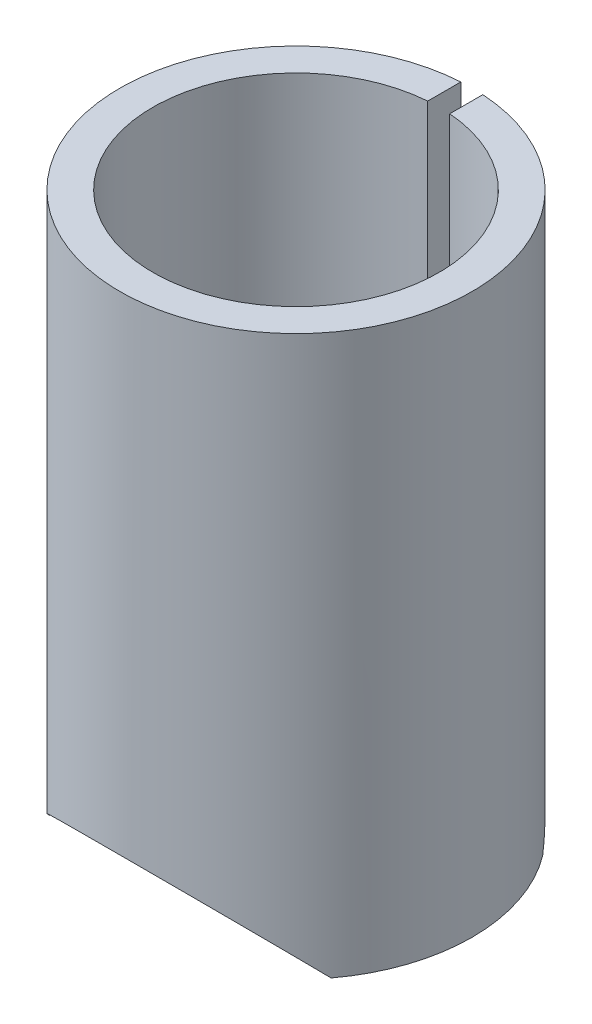
ISO-10303-21;
HEADER;
FILE_DESCRIPTION(('STEP AP214'),'2;1');
FILE_NAME('part.step','',(''),(''),'','','');
FILE_SCHEMA(('AUTOMOTIVE_DESIGN { 1 0 10303 214 1 1 1 1 }'));
ENDSEC;
DATA;
#1=APPLICATION_CONTEXT('core data for automotive mechanical design processes');
#2=APPLICATION_PROTOCOL_DEFINITION('international standard','automotive_design',2000,#1);
#3=PRODUCT_CONTEXT('',#1,'mechanical');
#4=PRODUCT('Part','Part','',(#3));
#5=PRODUCT_RELATED_PRODUCT_CATEGORY('part','',(#4));
#6=PRODUCT_DEFINITION_FORMATION('','',#4);
#7=PRODUCT_DEFINITION_CONTEXT('part definition',#1,'design');
#8=PRODUCT_DEFINITION('design','',#6,#7);
#9=PRODUCT_DEFINITION_SHAPE('','',#8);
#10=(LENGTH_UNIT() NAMED_UNIT(*) SI_UNIT(.MILLI.,.METRE.));
#11=(NAMED_UNIT(*) PLANE_ANGLE_UNIT() SI_UNIT($,.RADIAN.));
#12=(NAMED_UNIT(*) SI_UNIT($,.STERADIAN.) SOLID_ANGLE_UNIT());
#13=UNCERTAINTY_MEASURE_WITH_UNIT(LENGTH_MEASURE(1.E-05),#10,'distance_accuracy_value','');
#14=(GEOMETRIC_REPRESENTATION_CONTEXT(3) GLOBAL_UNCERTAINTY_ASSIGNED_CONTEXT((#13)) GLOBAL_UNIT_ASSIGNED_CONTEXT((#10,
#11,#12)) REPRESENTATION_CONTEXT('',''));
#15=CARTESIAN_POINT('',(0.,0.,0.));
#16=DIRECTION('',(0.,0.,1.));
#17=DIRECTION('',(1.,0.,0.));
#18=AXIS2_PLACEMENT_3D('',#15,#16,#17);
#19=CARTESIAN_POINT('',(0.,50.8,0.));
#20=DIRECTION('',(0.,-1.,0.));
#21=DIRECTION('',(0.,0.,-1.));
#22=AXIS2_PLACEMENT_3D('',#19,#20,#21);
#23=CYLINDRICAL_SURFACE('',#22,16.);
#24=CARTESIAN_POINT('',(-12.79384724845,0.,-9.60819819650536));
#25=CARTESIAN_POINT('',(-12.6693024672504,0.169529334611263,-9.77403080939155));
#26=CARTESIAN_POINT('',(-12.5407617637278,0.337451045526014,-9.93848026084149));
#27=CARTESIAN_POINT('',(-12.2755069137093,0.669837630240323,-10.2643118466671));
#28=CARTESIAN_POINT('',(-12.1387915911634,0.834302002023927,-10.4256935352732));
#29=CARTESIAN_POINT('',(-11.7156858329925,1.32262901385855,-10.9052592597792));
#30=CARTESIAN_POINT('',(-11.416759722885,1.64084482744736,-11.2182954540475));
#31=CARTESIAN_POINT('',(-10.7801488129064,2.26355456731612,-11.831591568388));
#32=CARTESIAN_POINT('',(-10.4419733354527,2.56778904172608,-12.131606529646));
#33=CARTESIAN_POINT('',(-9.72977703418303,3.1536984503113,-12.7099008187051));
#34=CARTESIAN_POINT('',(-9.35578514111502,3.43539126048313,-12.9881973652235));
#35=CARTESIAN_POINT('',(-8.67737988089822,3.89951731030491,-13.4470296398035));
#36=CARTESIAN_POINT('',(-8.38138903912122,4.08823727743698,-13.6336948803436));
#37=CARTESIAN_POINT('',(-7.77028036736349,4.44932949627577,-13.99099652761));
#38=CARTESIAN_POINT('',(-7.45516266942979,4.62170186082118,-14.161633044974));
#39=CARTESIAN_POINT('',(-6.8089154118803,4.94660733170356,-14.483367990926));
#40=CARTESIAN_POINT('',(-6.47792773606816,5.09928290552856,-14.6346066721111));
#41=CARTESIAN_POINT('',(-5.79880578094874,5.38402179146855,-14.9167353306034));
#42=CARTESIAN_POINT('',(-5.45067294940109,5.51608684005092,-15.0476270221712));
#43=CARTESIAN_POINT('',(-4.7755851939161,5.74484643628369,-15.2743969120742));
#44=CARTESIAN_POINT('',(-4.45013579864268,5.84378201607454,-15.3724918337358));
#45=CARTESIAN_POINT('',(-3.78858815389419,6.02153159027606,-15.5487537370956));
#46=CARTESIAN_POINT('',(-3.45249277670938,6.10035096093578,-15.6269260432952));
#47=CARTESIAN_POINT('',(-2.7672008982961,6.2373458721786,-15.7628084098333));
#48=CARTESIAN_POINT('',(-2.41789037761171,6.29523707091493,-15.8202366214563));
#49=CARTESIAN_POINT('',(-1.88929498379849,6.36461204967696,-15.8890604143024));
#50=CARTESIAN_POINT('',(-1.71221222716816,6.38483394346233,-15.9091224065859));
#51=CARTESIAN_POINT('',(-1.35688862180969,6.41934339582588,-15.9433597569812));
#52=CARTESIAN_POINT('',(-1.1786476771473,6.43363045628244,-15.9575346209753));
#53=CARTESIAN_POINT('',(-1.,6.44490371925531,-15.9687194226713));
#54=B_SPLINE_CURVE_WITH_KNOTS('',3,(#24,#25,#26,#27,#28,#29,#30,#31,#32,#33,#34,#35,#36,#37,#38,
#39,#40,#41,#42,#43,#44,#45,#46,#47,#48,#49,#50,#51,#52,#53),.UNSPECIFIED.,.F.,.F.,(4,2,2,2,2,2,
2,2,2,2,2,2,2,2,4),(0.,0.803520479414997,1.60715683756388,3.21717330498239,4.85008284355833,
6.48168434746617,7.67343561972789,8.86517866537295,10.0477504796033,11.2302226065509,
12.291052046173,13.3515976713976,14.4260542590897,14.9639587340448,15.5019083472071),.UNSPECIFIED.);
#55=CARTESIAN_POINT('',(-12.79384724845,0.,-9.60819819650536));
#56=VERTEX_POINT('',#55);
#57=CARTESIAN_POINT('',(-0.999999999999999,6.44490371925531,-15.9687194226713));
#58=VERTEX_POINT('',#57);
#59=EDGE_CURVE('E97',#56,#58,#54,.T.);
#60=ORIENTED_EDGE('',*,*,#59,.F.);
#61=CARTESIAN_POINT('',(0.,0.,0.));
#62=DIRECTION('',(0.,1.,0.));
#63=DIRECTION('',(0.,0.,1.));
#64=AXIS2_PLACEMENT_3D('',#61,#62,#63);
#65=CIRCLE('',#64,16.);
#66=CARTESIAN_POINT('',(-12.79384724845,0.,9.60819819650536));
#67=VERTEX_POINT('',#66);
#68=EDGE_CURVE('E109',#56,#67,#65,.T.);
#69=ORIENTED_EDGE('',*,*,#68,.T.);
#70=CARTESIAN_POINT('',(12.79384724845,0.,9.60819819650536));
#71=CARTESIAN_POINT('',(12.6690852528029,0.169824951877521,9.77431999019347));
#72=CARTESIAN_POINT('',(12.5403134742779,0.338036622985206,9.93905373663259));
#73=CARTESIAN_POINT('',(12.2745709993002,0.670986428265067,10.2654385502669));
#74=CARTESIAN_POINT('',(12.1375993229954,0.835724144121324,10.4270892459953));
#75=CARTESIAN_POINT('',(11.7136767718155,1.32485471849579,10.9074468870804));
#76=CARTESIAN_POINT('',(11.4141457886588,1.64357975341527,11.220986452439));
#77=CARTESIAN_POINT('',(10.7772951324621,2.26616405245261,11.834164234297));
#78=CARTESIAN_POINT('',(10.4396039834411,2.56982677238943,12.133616868665));
#79=CARTESIAN_POINT('',(9.72849971888997,3.15466041942535,12.7108511949774));
#80=CARTESIAN_POINT('',(9.35511562337346,3.43584928293697,12.9886501642678));
#81=CARTESIAN_POINT('',(8.6778979526173,3.89916289227809,13.4466792636864));
#82=CARTESIAN_POINT('',(8.38246006145812,4.08755439835618,13.6330194372578));
#83=CARTESIAN_POINT('',(7.77259666662721,4.44801057480599,13.9896911853157));
#84=CARTESIAN_POINT('',(7.45817572337548,4.62007914120292,14.1600265797947));
#85=CARTESIAN_POINT('',(6.81209519684077,4.94511491642404,14.4818897272468));
#86=CARTESIAN_POINT('',(6.48050362962459,5.09815037965567,14.6334846726291));
#87=CARTESIAN_POINT('',(5.80012432004059,5.38352115142788,14.9162391363545));
#88=CARTESIAN_POINT('',(5.45133950728421,5.51585997060995,15.0474021204277));
#89=CARTESIAN_POINT('',(4.79272066249065,5.73904077527766,15.2686417522935));
#90=CARTESIAN_POINT('',(4.48506567423369,5.83313344942337,15.3619338275692));
#91=CARTESIAN_POINT('',(3.86009282483343,6.00338390694149,15.5307567260638));
#92=CARTESIAN_POINT('',(3.54277678483321,6.07954504712245,15.606290873588));
#93=CARTESIAN_POINT('',(2.90016486606022,6.21272051577611,15.7383817660368));
#94=CARTESIAN_POINT('',(2.57486706176275,6.26973017442401,15.794933882452));
#95=CARTESIAN_POINT('',(1.91852029273179,6.3635626405473,15.8880184749657));
#96=CARTESIAN_POINT('',(1.58747127080912,6.4003852471672,15.9245507518725));
#97=CARTESIAN_POINT('',(0.921077062899374,6.45322235887131,15.9769725065474));
#98=CARTESIAN_POINT('',(0.585721981483959,6.46917423216204,15.9927998500579));
#99=CARTESIAN_POINT('',(-0.0856580036182901,6.479749685218,16.0032926616542));
#100=CARTESIAN_POINT('',(-0.421682908082106,6.47437324022836,15.9979581051784));
#101=CARTESIAN_POINT('',(-1.091713864316,6.44239961061915,15.9662348335256));
#102=CARTESIAN_POINT('',(-1.42571991772176,6.41580244319505,15.9398461354092));
#103=CARTESIAN_POINT('',(-2.0891387360289,6.34190514065432,15.8665332348401));
#104=CARTESIAN_POINT('',(-2.41855155563991,6.29460525234384,15.8196092771971));
#105=CARTESIAN_POINT('',(-3.05445794793935,6.18298997334198,15.7088925444592));
#106=CARTESIAN_POINT('',(-3.36128348386068,6.11962227834028,15.6460393717547));
#107=CARTESIAN_POINT('',(-3.96692799611383,5.97595451732238,15.5035563961571));
#108=CARTESIAN_POINT('',(-4.26574745378373,5.89565547183199,15.4239276044035));
#109=CARTESIAN_POINT('',(-4.85395061368717,5.71927021922391,15.2490426981678));
#110=CARTESIAN_POINT('',(-5.14333513451419,5.62318538610364,15.153787943773));
#111=CARTESIAN_POINT('',(-5.71162548344993,5.41643817690445,14.9488669225349));
#112=CARTESIAN_POINT('',(-5.9905291902214,5.30577286991649,14.8391977581747));
#113=CARTESIAN_POINT('',(-6.64186745577242,5.02607891372777,14.5620861852096));
#114=CARTESIAN_POINT('',(-7.00914067363761,4.85094623585328,14.3886195290487));
#115=CARTESIAN_POINT('',(-7.72063185735061,4.47835014954258,14.0197208179977));
#116=CARTESIAN_POINT('',(-8.06484158851919,4.28087883216883,13.8242809837118));
#117=CARTESIAN_POINT('',(-8.73055504766056,3.86594655506848,13.4138293308644));
#118=CARTESIAN_POINT('',(-9.05198148362123,3.64842281846117,13.198756069112));
#119=CARTESIAN_POINT('',(-9.67071838717221,3.19665083787312,12.7523616244748));
#120=CARTESIAN_POINT('',(-9.96803258086791,2.96240518851721,12.5210429623676));
#121=CARTESIAN_POINT('',(-10.5009151079077,2.51157440895214,12.0762051333719));
#122=CARTESIAN_POINT('',(-10.7394406156208,2.29677324357849,11.8643998932036));
#123=CARTESIAN_POINT('',(-11.1988640336514,1.85763112821765,11.431754062255));
#124=CARTESIAN_POINT('',(-11.4197613254156,1.63328984390194,11.2109131548346));
#125=CARTESIAN_POINT('',(-11.8424310673271,1.17820282092752,10.7633993869514));
#126=CARTESIAN_POINT('',(-12.0443518650553,0.947528894570369,10.5367931476566));
#127=CARTESIAN_POINT('',(-12.4314981756074,0.478964630599622,10.0771042246174));
#128=CARTESIAN_POINT('',(-12.6167300780118,0.241077101841697,9.84402406460581));
#129=CARTESIAN_POINT('',(-12.79384724845,0.,9.60819819650536));
#130=B_SPLINE_CURVE_WITH_KNOTS('',3,(#70,#71,#72,#73,#74,#75,#76,#77,#78,#79,#80,#81,#82,#83,
#84,#85,#86,#87,#88,#89,#90,#91,#92,#93,#94,#95,#96,#97,#98,#99,#100,#101,#102,#103,#104,#105,
#106,#107,#108,#109,#110,#111,#112,#113,#114,#115,#116,#117,#118,#119,#120,#121,#122,#123,#124,
#125,#126,#127,#128,#129),.UNSPECIFIED.,.F.,.F.,(4,2,2,2,2,2,2,2,2,2,2,2,2,2,2,2,2,2,2,2,2,2,2,
2,2,2,2,2,2,4),(0.,0.80492125748732,1.60993889231568,3.22273927480333,4.85287016787993,
6.48168678295106,7.67128304869295,8.86059465858725,10.0455101513245,11.2302244357962,
12.2341361446072,13.2378597700313,14.2418279622807,15.2458061435501,16.2527903433136,
17.2597757118411,18.2667602643938,19.2737328125717,20.2313465425995,21.1889025695927,
22.1463752948734,23.1040407820119,24.4290618628268,25.7545535408894,27.0843457216692,
28.4139320143046,29.5670040782091,30.7201165842779,31.8632964054644,33.0060366674153),.UNSPECIFIED.);
#131=CARTESIAN_POINT('',(12.79384724845,0.,9.60819819650536));
#132=VERTEX_POINT('',#131);
#133=EDGE_CURVE('E186',#132,#67,#130,.T.);
#134=ORIENTED_EDGE('',*,*,#133,.F.);
#135=CARTESIAN_POINT('',(12.79384724845,0.,-9.60819819650536));
#136=VERTEX_POINT('',#135);
#137=EDGE_CURVE('E118',#132,#136,#65,.T.);
#138=ORIENTED_EDGE('',*,*,#137,.T.);
#139=CARTESIAN_POINT('',(1.,6.44490371925531,-15.9687194226713));
#140=CARTESIAN_POINT('',(1.18547172457296,6.4332001282649,-15.9571076749013));
#141=CARTESIAN_POINT('',(1.37050362035421,6.4182477366534,-15.9422727050464));
#142=CARTESIAN_POINT('',(1.73930207925117,6.38194990583475,-15.9062611468077));
#143=CARTESIAN_POINT('',(1.92306875958581,6.36060506725187,-15.8850851542165));
#144=CARTESIAN_POINT('',(2.47145846473481,6.28719954839732,-15.8122632331314));
#145=CARTESIAN_POINT('',(2.83366603392883,6.22573618993843,-15.7512919290152));
#146=CARTESIAN_POINT('',(3.54345871126054,6.08009693237568,-15.6068378237927));
#147=CARTESIAN_POINT('',(3.89117565775802,5.99624112248279,-15.5236722881847));
#148=CARTESIAN_POINT('',(4.57490417073995,5.80707844252569,-15.336099135948));
#149=CARTESIAN_POINT('',(4.91091316026076,5.70176688446471,-15.2316868769996));
#150=CARTESIAN_POINT('',(5.56785759511669,5.47204565267693,-15.0039769238808));
#151=CARTESIAN_POINT('',(5.88885256805341,5.34772156917719,-14.8807638720245));
#152=CARTESIAN_POINT('',(6.51603626748154,5.08151966823655,-14.6170111792838));
#153=CARTESIAN_POINT('',(6.82222554371201,4.93964250324293,-14.4764721824047));
#154=CARTESIAN_POINT('',(7.42109209925152,4.63909689787776,-14.1788573080201));
#155=CARTESIAN_POINT('',(7.71365802839799,4.48031640804073,-14.0216711195309));
#156=CARTESIAN_POINT('',(8.28243826317573,4.14858090785009,-13.6933952421956));
#157=CARTESIAN_POINT('',(8.55865175588891,3.97562519383014,-13.522304863141));
#158=CARTESIAN_POINT('',(9.2341322064654,3.52376718694605,-13.0755296530731));
#159=CARTESIAN_POINT('',(9.62258107093959,3.23659294220109,-12.791771167562));
#160=CARTESIAN_POINT('',(10.3616105865956,2.63800578277456,-12.2008694350301));
#161=CARTESIAN_POINT('',(10.7121538880463,2.32656947224561,-11.8937036227687));
#162=CARTESIAN_POINT('',(11.371658114673,1.68786396638424,-11.2645623574044));
#163=CARTESIAN_POINT('',(11.6810923010926,1.36084732001401,-10.942825710213));
#164=CARTESIAN_POINT('',(12.1183596012169,0.858629976139468,-10.449570292515));
#165=CARTESIAN_POINT('',(12.2595082699924,0.689448655370219,-10.2835462969273));
#166=CARTESIAN_POINT('',(12.5331313435408,0.347412639625851,-9.94823615065484));
#167=CARTESIAN_POINT('',(12.66560714018,0.17455854000375,-9.77895052908417));
#168=CARTESIAN_POINT('',(12.79384724845,0.,-9.60819819650536));
#169=B_SPLINE_CURVE_WITH_KNOTS('',3,(#139,#140,#141,#142,#143,#144,#145,#146,#147,#148,#149,
#150,#151,#152,#153,#154,#155,#156,#157,#158,#159,#160,#161,#162,#163,#164,#165,#166,#167,#168),
.UNSPECIFIED.,.F.,.F.,(4,2,2,2,2,2,2,2,2,2,2,2,2,2,4),(0.,0.558489426330008,1.11692639432515,
2.23231603182757,3.33254412845531,4.43301287891409,5.52866596590222,6.6242783397409,
7.72766833347106,8.83111313333391,10.5091396435261,12.1888047906746,13.8470505465297,
14.6745372270387,15.5018907810996),.UNSPECIFIED.);
#170=CARTESIAN_POINT('',(1.,6.44490371925531,-15.9687194226713));
#171=VERTEX_POINT('',#170);
#172=EDGE_CURVE('E55',#171,#136,#169,.T.);
#173=ORIENTED_EDGE('',*,*,#172,.F.);
#174=DIRECTION('',(0.,-1.,0.));
#175=VECTOR('',#174,1.);
#176=CARTESIAN_POINT('',(1.,50.8,-15.9687194226713));
#177=LINE('',#176,#175);
#178=CARTESIAN_POINT('',(1.,50.8,-15.9687194226713));
#179=VERTEX_POINT('',#178);
#180=EDGE_CURVE('E104',#179,#171,#177,.T.);
#181=ORIENTED_EDGE('',*,*,#180,.F.);
#182=CARTESIAN_POINT('',(0.,50.8,0.));
#183=DIRECTION('',(0.,1.,0.));
#184=DIRECTION('',(0.,0.,1.));
#185=AXIS2_PLACEMENT_3D('',#182,#183,#184);
#186=CIRCLE('',#185,16.);
#187=CARTESIAN_POINT('',(-0.999999999999999,50.8,-15.9687194226713));
#188=VERTEX_POINT('',#187);
#189=EDGE_CURVE('E143',#188,#179,#186,.T.);
#190=ORIENTED_EDGE('',*,*,#189,.F.);
#191=DIRECTION('',(0.,-1.,0.));
#192=VECTOR('',#191,1.);
#193=CARTESIAN_POINT('',(-0.999999999999999,50.8,-15.9687194226713));
#194=LINE('',#193,#192);
#195=EDGE_CURVE('E112',#188,#58,#194,.T.);
#196=ORIENTED_EDGE('',*,*,#195,.T.);
#197=EDGE_LOOP('',(#60,#69,#134,#138,#173,#181,#190,#196));
#198=FACE_BOUND('',#197,.T.);
#199=ADVANCED_FACE('F33',(#198),#23,.T.);
#200=CARTESIAN_POINT('',(1.,50.8,-15.9687194226713));
#201=DIRECTION('',(1.,0.,0.));
#202=DIRECTION('',(0.,0.,-1.));
#203=AXIS2_PLACEMENT_3D('',#200,#201,#202);
#204=PLANE('',#203);
#205=DIRECTION('',(0.,0.,-1.));
#206=VECTOR('',#205,1.);
#207=CARTESIAN_POINT('',(1.,6.44490371925531,50.8));
#208=LINE('',#207,#206);
#209=CARTESIAN_POINT('',(1.,6.44490371925531,-12.9614813968157));
#210=VERTEX_POINT('',#209);
#211=EDGE_CURVE('E140',#210,#171,#208,.T.);
#212=ORIENTED_EDGE('',*,*,#211,.F.);
#213=DIRECTION('',(0.,-1.,0.));
#214=VECTOR('',#213,1.);
#215=CARTESIAN_POINT('',(1.,50.8,-12.9614813968157));
#216=LINE('',#215,#214);
#217=CARTESIAN_POINT('',(1.,50.8,-12.9614813968157));
#218=VERTEX_POINT('',#217);
#219=EDGE_CURVE('E131',#218,#210,#216,.T.);
#220=ORIENTED_EDGE('',*,*,#219,.F.);
#221=DIRECTION('',(0.,0.,1.));
#222=VECTOR('',#221,1.);
#223=CARTESIAN_POINT('',(1.,50.8,-15.9687194226713));
#224=LINE('',#223,#222);
#225=EDGE_CURVE('E141',#179,#218,#224,.T.);
#226=ORIENTED_EDGE('',*,*,#225,.F.);
#227=ORIENTED_EDGE('',*,*,#180,.T.);
#228=EDGE_LOOP('',(#212,#220,#226,#227));
#229=FACE_BOUND('',#228,.T.);
#230=ADVANCED_FACE('F138',(#229),#204,.F.);
#231=CARTESIAN_POINT('',(0.,50.8,0.));
#232=DIRECTION('',(0.,-1.,0.));
#233=DIRECTION('',(0.,0.,-1.));
#234=AXIS2_PLACEMENT_3D('',#231,#232,#233);
#235=CYLINDRICAL_SURFACE('',#234,13.);
#236=CARTESIAN_POINT('',(-1.00000000000001,6.44490371925531,-12.9614813968157));
#237=CARTESIAN_POINT('',(-1.16168460517088,6.43470116658491,-12.949009202521));
#238=CARTESIAN_POINT('',(-1.32295354122061,6.42203411514546,-12.9335209022287));
#239=CARTESIAN_POINT('',(-1.6443407947073,6.3918651269646,-12.8966003581299));
#240=CARTESIAN_POINT('',(-1.80445921294105,6.37436361920188,-12.8751686417035));
#241=CARTESIAN_POINT('',(-2.28226435491098,6.31479360197139,-12.8021459817368));
#242=CARTESIAN_POINT('',(-2.59779643892761,6.26563426988923,-12.7417966945841));
#243=CARTESIAN_POINT('',(-3.21770579171572,6.15008486916114,-12.5994728070134));
#244=CARTESIAN_POINT('',(-3.52215518581641,6.08384514644398,-12.5176867993832));
#245=CARTESIAN_POINT('',(-4.12081712275603,5.93536779285577,-12.3335701969476));
#246=CARTESIAN_POINT('',(-4.41502750417565,5.85312680803494,-12.2312352948401));
#247=CARTESIAN_POINT('',(-4.99045073007591,5.67463405513847,-12.0079268274543));
#248=CARTESIAN_POINT('',(-5.27170886590668,5.57843691847982,-11.8870258359598));
#249=CARTESIAN_POINT('',(-5.82126189222369,5.37351767768967,-11.6277780066907));
#250=CARTESIAN_POINT('',(-6.08955751058016,5.26479627798249,-11.4894321500573));
#251=CARTESIAN_POINT('',(-6.61299505011281,5.03630740713117,-11.1963598555654));
#252=CARTESIAN_POINT('',(-6.86810641235222,4.91651592342009,-11.0415976956683));
#253=CARTESIAN_POINT('',(-7.36405841651424,4.66781880703723,-10.7172047597714));
#254=CARTESIAN_POINT('',(-7.60489611950441,4.53891130928789,-10.5475709394142));
#255=CARTESIAN_POINT('',(-8.16143134781563,4.22290517461898,-10.1269421289938));
#256=CARTESIAN_POINT('',(-8.47048517484968,4.03242374920819,-9.86966336382369));
#257=CARTESIAN_POINT('',(-9.06036418033587,3.64177804142521,-9.33110018772757));
#258=CARTESIAN_POINT('',(-9.34117824650905,3.44160999292508,-9.04980640682669));
#259=CARTESIAN_POINT('',(-9.87493889258787,3.03581137902509,-8.46421206035138));
#260=CARTESIAN_POINT('',(-10.1278249340884,2.83017010141794,-8.15986383659112));
#261=CARTESIAN_POINT('',(-10.6048166113378,2.41889914991497,-7.52954579399092));
#262=CARTESIAN_POINT('',(-10.8289313547232,2.21326949304557,-7.20358286714338));
#263=CARTESIAN_POINT('',(-11.2040040781732,1.85038815782861,-6.60064452701017));
#264=CARTESIAN_POINT('',(-11.3604476177235,1.69203430674639,-6.32773107879425));
#265=CARTESIAN_POINT('',(-11.6546376009921,1.38246138049606,-5.76796453523237));
#266=CARTESIAN_POINT('',(-11.7923803209399,1.23124373021182,-5.48110867902457));
#267=CARTESIAN_POINT('',(-12.0475720839571,0.941100328644243,-4.89466464291197));
#268=CARTESIAN_POINT('',(-12.1651252266533,0.802113444016163,-4.59515234762182));
#269=CARTESIAN_POINT('',(-12.3794258290755,0.540945195026911,-3.98185259155036));
#270=CARTESIAN_POINT('',(-12.4761928991,0.418748030244257,-3.66807892714265));
#271=CARTESIAN_POINT('',(-12.6068632004571,0.249649721079972,-3.1777054536863));
#272=CARTESIAN_POINT('',(-12.6489054084362,0.194396696907378,-3.00612134849223));
#273=CARTESIAN_POINT('',(-12.7264190349782,0.0913219049683202,-2.65893906718539));
#274=CARTESIAN_POINT('',(-12.761878683139,0.0435134731517061,-2.48333431946927));
#275=CARTESIAN_POINT('',(-12.79384724845,0.,-2.30596456679819));
#276=B_SPLINE_CURVE_WITH_KNOTS('',3,(#236,#237,#238,#239,#240,#241,#242,#243,#244,#245,#246,
#247,#248,#249,#250,#251,#252,#253,#254,#255,#256,#257,#258,#259,#260,#261,#262,#263,#264,#265,
#266,#267,#268,#269,#270,#271,#272,#273,#274,#275),.UNSPECIFIED.,.F.,.F.,(4,2,2,2,2,2,2,2,2,2,2,
2,2,2,2,2,2,2,2,4),(0.,0.487357164164118,0.974671097259547,1.9481113771675,2.913259478235,
3.87861009784831,4.84027900451509,5.80189384871854,6.76564585489373,7.72959561216358,
9.0626217449633,10.3961703845968,11.7325551987373,13.0685159278208,14.1243146724929,
15.1803233439948,16.2307120461671,17.2801053801202,17.8351236669502,18.3911250292047),.UNSPECIFIED.);
#277=CARTESIAN_POINT('',(-1.00000000000001,6.44490371925531,-12.9614813968157));
#278=VERTEX_POINT('',#277);
#279=CARTESIAN_POINT('',(-12.79384724845,0.,-2.30596456679819));
#280=VERTEX_POINT('',#279);
#281=EDGE_CURVE('E48',#278,#280,#276,.T.);
#282=ORIENTED_EDGE('',*,*,#281,.F.);
#283=DIRECTION('',(0.,-1.,0.));
#284=VECTOR('',#283,1.);
#285=CARTESIAN_POINT('',(-0.999999999999999,50.8,-12.9614813968157));
#286=LINE('',#285,#284);
#287=CARTESIAN_POINT('',(-0.999999999999999,50.8,-12.9614813968157));
#288=VERTEX_POINT('',#287);
#289=EDGE_CURVE('E128',#288,#278,#286,.T.);
#290=ORIENTED_EDGE('',*,*,#289,.F.);
#291=CARTESIAN_POINT('',(0.,50.8,0.));
#292=DIRECTION('',(0.,-1.,0.));
#293=DIRECTION('',(0.,0.,1.));
#294=AXIS2_PLACEMENT_3D('',#291,#292,#293);
#295=CIRCLE('',#294,13.);
#296=EDGE_CURVE('E279',#218,#288,#295,.T.);
#297=ORIENTED_EDGE('',*,*,#296,.F.);
#298=ORIENTED_EDGE('',*,*,#219,.T.);
#299=CARTESIAN_POINT('',(12.79384724845,0.,-2.30596456679819));
#300=CARTESIAN_POINT('',(12.7289865362803,0.0883237302954588,-2.6656227196957));
#301=CARTESIAN_POINT('',(12.6499286094855,0.194026079843621,-3.01759717168182));
#302=CARTESIAN_POINT('',(12.4661140497645,0.431680982529166,-3.70433717060781));
#303=CARTESIAN_POINT('',(12.3614445087132,0.563544294085171,-4.03915648187601));
#304=CARTESIAN_POINT('',(12.1291454619756,0.845096831474522,-4.6907349647587));
#305=CARTESIAN_POINT('',(12.0016186386027,0.994705362920269,-5.00756688593463));
#306=CARTESIAN_POINT('',(11.7246458232887,1.30618692979649,-5.62560642961785));
#307=CARTESIAN_POINT('',(11.575176827923,1.46807274915312,-5.92679720031352));
#308=CARTESIAN_POINT('',(11.2192371015004,1.83637023997657,-6.58001753816548));
#309=CARTESIAN_POINT('',(11.0075160222977,2.04458234693212,-6.92817114501146));
#310=CARTESIAN_POINT('',(10.553638655389,2.4644830603295,-7.6016811935335));
#311=CARTESIAN_POINT('',(10.311484469192,2.6761714258473,-7.92703920690857));
#312=CARTESIAN_POINT('',(9.79637463799391,3.0977408521701,-8.55549710130543));
#313=CARTESIAN_POINT('',(9.52333977452937,3.30761570685066,-8.85853628584192));
#314=CARTESIAN_POINT('',(8.9471353431079,3.71973192402644,-9.44013986762312));
#315=CARTESIAN_POINT('',(8.64397278270528,3.92197504659575,-9.71870992799997));
#316=CARTESIAN_POINT('',(8.07419709969452,4.27294820733959,-10.193856203676));
#317=CARTESIAN_POINT('',(7.81317133043631,4.42403388880052,-10.3954071194876));
#318=CARTESIAN_POINT('',(7.2727014950794,4.71588148131423,-10.7804385804781));
#319=CARTESIAN_POINT('',(6.99326162178123,4.85664572719063,-10.9639232156904));
#320=CARTESIAN_POINT('',(6.4177291151034,5.12481664804748,-11.3103967439603));
#321=CARTESIAN_POINT('',(6.12171345465195,5.25227828480544,-11.4734705738001));
#322=CARTESIAN_POINT('',(5.51288567315235,5.4920564882324,-11.7781122354694));
#323=CARTESIAN_POINT('',(5.2000737930097,5.60437327204053,-11.9196803756401));
#324=CARTESIAN_POINT('',(4.5796253352057,5.80478706732602,-12.1709396714945));
#325=CARTESIAN_POINT('',(4.27293302902693,5.89397245542353,-12.2820888005798));
#326=CARTESIAN_POINT('',(3.64797994317333,6.05497301217917,-12.4819806893917));
#327=CARTESIAN_POINT('',(3.3297226480412,6.12679336383437,-12.5707301351701));
#328=CARTESIAN_POINT('',(2.68013404909632,6.25208738204351,-12.7251516286102));
#329=CARTESIAN_POINT('',(2.34869653643855,6.30534755353611,-12.7905553289302));
#330=CARTESIAN_POINT('',(1.84640739864269,6.36959545617546,-12.8693281030142));
#331=CARTESIAN_POINT('',(1.67799652936716,6.38841242986741,-12.8923733778556));
#332=CARTESIAN_POINT('',(1.33987792263034,6.42069808192795,-12.9318871883901));
#333=CARTESIAN_POINT('',(1.17017004910456,6.4341661910916,-12.9483550241393));
#334=CARTESIAN_POINT('',(1.,6.44490371925531,-12.9614813968157));
#335=B_SPLINE_CURVE_WITH_KNOTS('',3,(#299,#300,#301,#302,#303,#304,#305,#306,#307,#308,#309,
#310,#311,#312,#313,#314,#315,#316,#317,#318,#319,#320,#321,#322,#323,#324,#325,#326,#327,#328,
#329,#330,#331,#332,#333,#334),.UNSPECIFIED.,.F.,.F.,(4,2,2,2,2,2,2,2,2,2,2,2,2,2,2,2,2,4),(0.,
1.12602708474223,2.24827708539222,3.36560647761725,4.48411571766968,5.85517063900117,
7.226130936318,8.60069154705081,9.97493318672504,11.0622062475328,12.1492325913941,
13.2315733596153,14.3138986081398,15.3271349469026,16.3400684874609,17.3642962693315,
17.877164660957,18.3900876153872),.UNSPECIFIED.);
#336=CARTESIAN_POINT('',(12.79384724845,0.,-2.30596456679819));
#337=VERTEX_POINT('',#336);
#338=EDGE_CURVE('E146',#337,#210,#335,.T.);
#339=ORIENTED_EDGE('',*,*,#338,.F.);
#340=CARTESIAN_POINT('',(0.,0.,0.));
#341=DIRECTION('',(0.,-1.,0.));
#342=DIRECTION('',(0.,0.,1.));
#343=AXIS2_PLACEMENT_3D('',#340,#341,#342);
#344=CIRCLE('',#343,13.);
#345=CARTESIAN_POINT('',(12.79384724845,0.,2.30596456679819));
#346=VERTEX_POINT('',#345);
#347=EDGE_CURVE('E120',#337,#346,#344,.T.);
#348=ORIENTED_EDGE('',*,*,#347,.T.);
#349=CARTESIAN_POINT('',(-12.79384724845,0.,2.30596456679819));
#350=CARTESIAN_POINT('',(-12.7289941693889,0.0883133073585914,2.66558051637534));
#351=CARTESIAN_POINT('',(-12.6499471562631,0.194001264241699,3.01751465408816));
#352=CARTESIAN_POINT('',(-12.4661601383034,0.431622216655772,3.70417817820767));
#353=CARTESIAN_POINT('',(-12.3615071950394,0.563465999413306,4.0389613092286));
#354=CARTESIAN_POINT('',(-12.1292191413011,0.845009841028322,4.69054755949463));
#355=CARTESIAN_POINT('',(-12.0016812494834,0.994633493658046,5.00741955565577));
#356=CARTESIAN_POINT('',(-11.7246810135593,1.30614881406487,5.62553552922674));
#357=CARTESIAN_POINT('',(-11.5751956532894,1.46805327341735,5.92676264545438));
#358=CARTESIAN_POINT('',(-11.2191850457827,1.83642409905011,6.58011307882477));
#359=CARTESIAN_POINT('',(-11.0074035715579,2.04469291275459,6.92835610865735));
#360=CARTESIAN_POINT('',(-10.5533890993416,2.46470739090486,7.6020334049529));
#361=CARTESIAN_POINT('',(-10.311158166839,2.67645281867404,7.92746921617614));
#362=CARTESIAN_POINT('',(-9.79601490144173,3.09802086090877,8.55590397741615));
#363=CARTESIAN_POINT('',(-9.52303928796187,3.30783851145194,8.85885444074279));
#364=CARTESIAN_POINT('',(-8.94697154284325,3.71984118548186,9.44029034673891));
#365=CARTESIAN_POINT('',(-8.6438866868913,3.92202803668135,9.71878166929065));
#366=CARTESIAN_POINT('',(-8.07450228623512,4.27276025155359,10.1936017470093));
#367=CARTESIAN_POINT('',(-7.81380455898067,4.42366745287237,10.3949182589209));
#368=CARTESIAN_POINT('',(-7.27399301156321,4.71520847843492,10.7795561023108));
#369=CARTESIAN_POINT('',(-6.99488055810607,4.85584306346391,10.9628787667516));
#370=CARTESIAN_POINT('',(-6.4193875386527,5.12409179022615,11.3094675829403));
#371=CARTESIAN_POINT('',(-6.12304341467827,5.25173194458454,11.472773943194));
#372=CARTESIAN_POINT('',(-5.51354850656821,5.49181791033535,11.77781160812));
#373=CARTESIAN_POINT('',(-5.20040049494023,5.60426621755756,11.9195464572062));
#374=CARTESIAN_POINT('',(-4.61196626992602,5.79434175172577,12.1578441051664));
#375=CARTESIAN_POINT('',(-4.33899819363627,5.87465162148891,12.2580005368459));
#376=CARTESIAN_POINT('',(-3.78365012328984,6.02161512945346,12.4406347358255));
#377=CARTESIAN_POINT('',(-3.50127185620483,6.08827125753616,12.5231157265265));
#378=CARTESIAN_POINT('',(-2.92866024383279,6.2066875553309,12.6692635437325));
#379=CARTESIAN_POINT('',(-2.63842819207738,6.25845016189021,12.7329334481144));
#380=CARTESIAN_POINT('',(-2.05193278035687,6.34605232185359,12.8405003054543));
#381=CARTESIAN_POINT('',(-1.75566934802415,6.38189168408448,12.884397021017));
#382=CARTESIAN_POINT('',(-1.15816088033427,6.43698059208147,12.9518100264116));
#383=CARTESIAN_POINT('',(-0.856901376745406,6.4561677060491,12.9752496212295));
#384=CARTESIAN_POINT('',(-0.252872230889276,6.47729330781151,13.0010550147228));
#385=CARTESIAN_POINT('',(0.0498974141979026,6.47923176338544,13.0034207740321));
#386=CARTESIAN_POINT('',(0.654464812484766,6.4658164420658,12.9870365873959));
#387=CARTESIAN_POINT('',(0.956262600401268,6.45046328989424,12.9682874043044));
#388=CARTESIAN_POINT('',(1.55647847812885,6.40281171661567,12.9100072124668));
#389=CARTESIAN_POINT('',(1.85489666007911,6.37051375862153,12.8704767716863));
#390=CARTESIAN_POINT('',(2.42845850899681,6.29209543097665,12.7742728960926));
#391=CARTESIAN_POINT('',(2.7039282561753,6.24691511319471,12.7187634678517));
#392=CARTESIAN_POINT('',(3.2482586686241,6.14302725445712,12.5907499769434));
#393=CARTESIAN_POINT('',(3.51711965475578,6.0843203716698,12.5182467411487));
#394=CARTESIAN_POINT('',(4.04686277742269,5.95437598852389,12.3571662156812));
#395=CARTESIAN_POINT('',(4.30774473954413,5.8831382144815,12.2685885749304));
#396=CARTESIAN_POINT('',(4.82049879734449,5.72922362884964,12.0763322495548));
#397=CARTESIAN_POINT('',(5.0723675448703,5.64654262081564,11.9726480243288));
#398=CARTESIAN_POINT('',(5.58898339535691,5.46281856030541,11.740981437564));
#399=CARTESIAN_POINT('',(5.85276739662174,5.36078452201096,11.6116387532177));
#400=CARTESIAN_POINT('',(6.36772415058405,5.14603790574467,11.3374262903485));
#401=CARTESIAN_POINT('',(6.61889165770404,5.03332094143194,11.1925501306471));
#402=CARTESIAN_POINT('',(7.10795264378975,4.79883122965558,10.8885219794568));
#403=CARTESIAN_POINT('',(7.34584708050302,4.6770591370676,10.7293710201639));
#404=CARTESIAN_POINT('',(7.80807515120724,4.42600269881002,10.3978304272605));
#405=CARTESIAN_POINT('',(8.03240690259461,4.29671731510108,10.2254389632733));
#406=CARTESIAN_POINT('',(8.51255949188611,4.0046574331039,9.83116885648541));
#407=CARTESIAN_POINT('',(8.76522290714549,3.84051114790747,9.60645582293937));
#408=CARTESIAN_POINT('',(9.25033664169817,3.50622438699519,9.14026693473171));
#409=CARTESIAN_POINT('',(9.48278365272756,3.33608293659234,8.89878834809552));
#410=CARTESIAN_POINT('',(9.92783195012977,2.9922743042613,8.39941972182738));
#411=CARTESIAN_POINT('',(10.1403911687194,2.81860055431189,8.14149675177576));
#412=CARTESIAN_POINT('',(10.5449931843471,2.47113302981711,7.61016583242126));
#413=CARTESIAN_POINT('',(10.7370383938203,2.29733927180929,7.33675970972687));
#414=CARTESIAN_POINT('',(11.090566789267,1.96237297291006,6.78966864875658));
#415=CARTESIAN_POINT('',(11.2531401411811,1.80102555661664,6.51679547429512));
#416=CARTESIAN_POINT('',(11.5593045602757,1.48474554973308,5.95687145883977));
#417=CARTESIAN_POINT('',(11.7028907638067,1.32981460970749,5.6698170110101));
#418=CARTESIAN_POINT('',(11.9696085088932,1.03138585490008,5.08252135060898));
#419=CARTESIAN_POINT('',(12.0928309598957,0.887838801254163,4.78234675236789));
#420=CARTESIAN_POINT('',(12.3182741308058,0.616758482163517,4.16739896741527));
#421=CARTESIAN_POINT('',(12.4205134529111,0.489211071886728,3.85263901723142));
#422=CARTESIAN_POINT('',(12.5674194406749,0.301117952866389,3.33204491134053));
#423=CARTESIAN_POINT('',(12.6191334980351,0.233628609589405,3.13069935283251));
#424=CARTESIAN_POINT('',(12.713480431967,0.108752145865867,2.72239142709964));
#425=CARTESIAN_POINT('',(12.7560958228399,0.0513845132629002,2.51541909139025));
#426=CARTESIAN_POINT('',(12.79384724845,0.,2.30596456679819));
#427=B_SPLINE_CURVE_WITH_KNOTS('',3,(#349,#350,#351,#352,#353,#354,#355,#356,#357,#358,#359,
#360,#361,#362,#363,#364,#365,#366,#367,#368,#369,#370,#371,#372,#373,#374,#375,#376,#377,#378,
#379,#380,#381,#382,#383,#384,#385,#386,#387,#388,#389,#390,#391,#392,#393,#394,#395,#396,#397,
#398,#399,#400,#401,#402,#403,#404,#405,#406,#407,#408,#409,#410,#411,#412,#413,#414,#415,#416,
#417,#418,#419,#420,#421,#422,#423,#424,#425,#426),.UNSPECIFIED.,.F.,.F.,(4,2,2,2,2,2,2,2,2,2,2,
2,2,2,2,2,2,2,2,2,2,2,2,2,2,2,2,2,2,2,2,2,2,2,2,2,2,2,4),(0.,1.12589534147448,2.24801451365843,
3.36547499634482,4.48411583538474,5.85553476386112,7.22686071453778,8.60106265363802,
9.97493333051122,11.0608887182115,12.1467635988428,13.2304201376884,14.3138984283103,
15.2179448130559,16.1218261898404,17.0255595912098,17.9293038424355,18.8364219093603,
19.7435416708002,20.6506286603023,21.5576908598031,22.4106147318333,23.2634971115127,
24.116398121078,24.9696127380007,25.9017319301258,26.8342355162774,27.766671728331,
28.6992370738396,29.825801101448,30.9525491373485,32.0816290608852,33.2105760587879,
34.2785805448178,35.346858077568,36.4102295571065,37.4726542133186,38.1278862412126,
38.7843663715469),.UNSPECIFIED.);
#428=CARTESIAN_POINT('',(-12.79384724845,0.,2.30596456679819));
#429=VERTEX_POINT('',#428);
#430=EDGE_CURVE('E180',#429,#346,#427,.T.);
#431=ORIENTED_EDGE('',*,*,#430,.F.);
#432=EDGE_CURVE('E117',#429,#280,#344,.T.);
#433=ORIENTED_EDGE('',*,*,#432,.T.);
#434=EDGE_LOOP('',(#282,#290,#297,#298,#339,#348,#431,#433));
#435=FACE_BOUND('',#434,.T.);
#436=ADVANCED_FACE('F195',(#435),#235,.F.);
#437=CARTESIAN_POINT('',(-0.999999999999999,50.8,-15.9687194226713));
#438=DIRECTION('',(-1.,0.,0.));
#439=DIRECTION('',(0.,0.,1.));
#440=AXIS2_PLACEMENT_3D('',#437,#438,#439);
#441=PLANE('',#440);
#442=DIRECTION('',(0.,0.,-1.));
#443=VECTOR('',#442,1.);
#444=CARTESIAN_POINT('',(-0.999999999999999,6.44490371925531,50.8));
#445=LINE('',#444,#443);
#446=EDGE_CURVE('E113',#58,#278,#445,.F.);
#447=ORIENTED_EDGE('',*,*,#446,.F.);
#448=ORIENTED_EDGE('',*,*,#195,.F.);
#449=DIRECTION('',(0.,0.,-1.));
#450=VECTOR('',#449,1.);
#451=CARTESIAN_POINT('',(-0.999999999999999,50.8,-15.9687194226713));
#452=LINE('',#451,#450);
#453=EDGE_CURVE('E124',#288,#188,#452,.T.);
#454=ORIENTED_EDGE('',*,*,#453,.F.);
#455=ORIENTED_EDGE('',*,*,#289,.T.);
#456=EDGE_LOOP('',(#447,#448,#454,#455));
#457=FACE_BOUND('',#456,.T.);
#458=ADVANCED_FACE('F199',(#457),#441,.F.);
#459=CARTESIAN_POINT('',(0.,0.,0.));
#460=DIRECTION('',(0.,1.,0.));
#461=DIRECTION('',(0.,0.,1.));
#462=AXIS2_PLACEMENT_3D('',#459,#460,#461);
#463=PLANE('',#462);
#464=DIRECTION('',(0.,0.,-1.));
#465=VECTOR('',#464,1.);
#466=CARTESIAN_POINT('',(12.79384724845,0.,50.8));
#467=LINE('',#466,#465);
#468=EDGE_CURVE('E11',#136,#337,#467,.F.);
#469=ORIENTED_EDGE('',*,*,#468,.F.);
#470=ORIENTED_EDGE('',*,*,#137,.F.);
#471=EDGE_CURVE('E37',#346,#132,#467,.F.);
#472=ORIENTED_EDGE('',*,*,#471,.F.);
#473=ORIENTED_EDGE('',*,*,#347,.F.);
#474=EDGE_LOOP('',(#469,#470,#472,#473));
#475=FACE_BOUND('',#474,.T.);
#476=ADVANCED_FACE('F233',(#475),#463,.F.);
#477=DIRECTION('',(0.,0.,-1.));
#478=VECTOR('',#477,1.);
#479=CARTESIAN_POINT('',(-12.79384724845,0.,50.8));
#480=LINE('',#479,#478);
#481=EDGE_CURVE('E103',#67,#429,#480,.T.);
#482=ORIENTED_EDGE('',*,*,#481,.F.);
#483=ORIENTED_EDGE('',*,*,#68,.F.);
#484=EDGE_CURVE('E94',#280,#56,#480,.T.);
#485=ORIENTED_EDGE('',*,*,#484,.F.);
#486=ORIENTED_EDGE('',*,*,#432,.F.);
#487=EDGE_LOOP('',(#482,#483,#485,#486));
#488=FACE_BOUND('',#487,.T.);
#489=ADVANCED_FACE('F116',(#488),#463,.F.);
#490=CARTESIAN_POINT('',(0.,50.8,0.));
#491=DIRECTION('',(0.,1.,0.));
#492=DIRECTION('',(0.,0.,1.));
#493=AXIS2_PLACEMENT_3D('',#490,#491,#492);
#494=PLANE('',#493);
#495=ORIENTED_EDGE('',*,*,#189,.T.);
#496=ORIENTED_EDGE('',*,*,#225,.T.);
#497=ORIENTED_EDGE('',*,*,#296,.T.);
#498=ORIENTED_EDGE('',*,*,#453,.T.);
#499=EDGE_LOOP('',(#495,#496,#497,#498));
#500=FACE_BOUND('',#499,.T.);
#501=ADVANCED_FACE('F161',(#500),#494,.T.);
#502=CARTESIAN_POINT('',(0.,-9.39856891145289,50.8));
#503=DIRECTION('',(0.,0.,-1.));
#504=DIRECTION('',(-1.,0.,0.));
#505=AXIS2_PLACEMENT_3D('',#502,#503,#504);
#506=CYLINDRICAL_SURFACE('',#505,15.875);
#507=ORIENTED_EDGE('',*,*,#446,.T.);
#508=ORIENTED_EDGE('',*,*,#281,.T.);
#509=ORIENTED_EDGE('',*,*,#484,.T.);
#510=ORIENTED_EDGE('',*,*,#59,.T.);
#511=EDGE_LOOP('',(#507,#508,#509,#510));
#512=FACE_BOUND('',#511,.T.);
#513=ADVANCED_FACE('F96',(#512),#506,.F.);
#514=ORIENTED_EDGE('',*,*,#471,.T.);
#515=ORIENTED_EDGE('',*,*,#133,.T.);
#516=ORIENTED_EDGE('',*,*,#481,.T.);
#517=ORIENTED_EDGE('',*,*,#430,.T.);
#518=EDGE_LOOP('',(#514,#515,#516,#517));
#519=FACE_BOUND('',#518,.T.);
#520=ADVANCED_FACE('F160',(#519),#506,.F.);
#521=ORIENTED_EDGE('',*,*,#172,.T.);
#522=ORIENTED_EDGE('',*,*,#468,.T.);
#523=ORIENTED_EDGE('',*,*,#338,.T.);
#524=ORIENTED_EDGE('',*,*,#211,.T.);
#525=EDGE_LOOP('',(#521,#522,#523,#524));
#526=FACE_BOUND('',#525,.T.);
#527=ADVANCED_FACE('F156',(#526),#506,.F.);
#528=CLOSED_SHELL('',(#199,#230,#436,#458,#476,#489,#501,#513,#520,#527));
#529=MANIFOLD_SOLID_BREP('B2',#528);
#530=ADVANCED_BREP_SHAPE_REPRESENTATION('',(#18,#529),#14);
#531=SHAPE_DEFINITION_REPRESENTATION(#9,#530);
ENDSEC;
END-ISO-10303-21;
